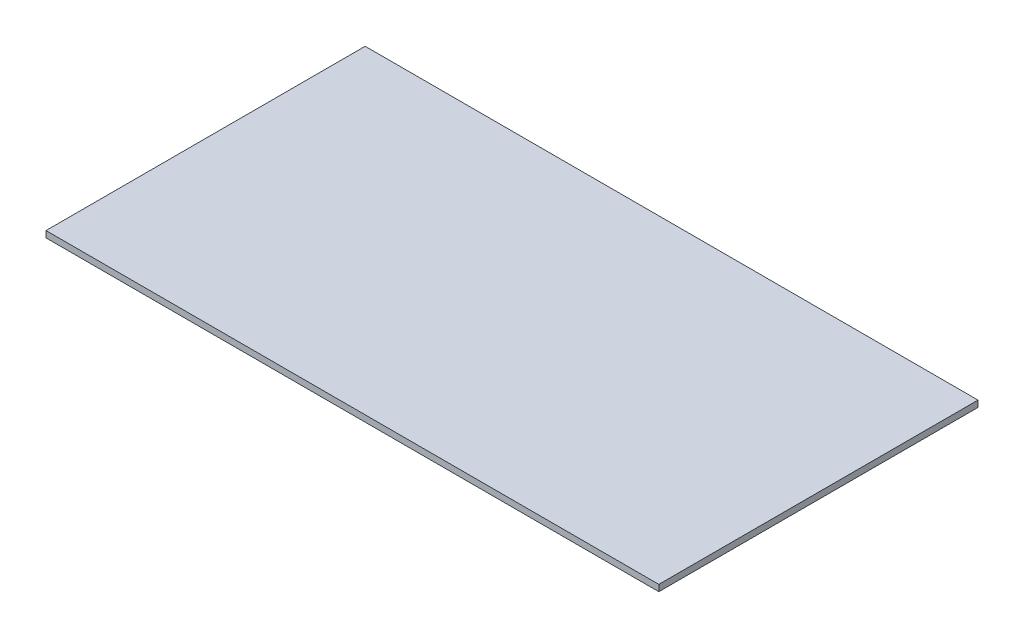
ISO-10303-21;
HEADER;
FILE_DESCRIPTION(('STEP AP214'),'2;1');
FILE_NAME('part.step','',(''),(''),'','','');
FILE_SCHEMA(('AUTOMOTIVE_DESIGN { 1 0 10303 214 1 1 1 1 }'));
ENDSEC;
DATA;
#1=APPLICATION_CONTEXT('core data for automotive mechanical design processes');
#2=APPLICATION_PROTOCOL_DEFINITION('international standard','automotive_design',2000,#1);
#3=PRODUCT_CONTEXT('',#1,'mechanical');
#4=PRODUCT('Part','Part','',(#3));
#5=PRODUCT_RELATED_PRODUCT_CATEGORY('part','',(#4));
#6=PRODUCT_DEFINITION_FORMATION('','',#4);
#7=PRODUCT_DEFINITION_CONTEXT('part definition',#1,'design');
#8=PRODUCT_DEFINITION('design','',#6,#7);
#9=PRODUCT_DEFINITION_SHAPE('','',#8);
#10=(LENGTH_UNIT() NAMED_UNIT(*) SI_UNIT(.MILLI.,.METRE.));
#11=(NAMED_UNIT(*) PLANE_ANGLE_UNIT() SI_UNIT($,.RADIAN.));
#12=(NAMED_UNIT(*) SI_UNIT($,.STERADIAN.) SOLID_ANGLE_UNIT());
#13=UNCERTAINTY_MEASURE_WITH_UNIT(LENGTH_MEASURE(1.E-05),#10,'distance_accuracy_value','');
#14=(GEOMETRIC_REPRESENTATION_CONTEXT(3) GLOBAL_UNCERTAINTY_ASSIGNED_CONTEXT((#13)) GLOBAL_UNIT_ASSIGNED_CONTEXT((#10,
#11,#12)) REPRESENTATION_CONTEXT('',''));
#15=CARTESIAN_POINT('',(0.,0.,0.));
#16=DIRECTION('',(0.,0.,1.));
#17=DIRECTION('',(1.,0.,0.));
#18=AXIS2_PLACEMENT_3D('',#15,#16,#17);
#19=CARTESIAN_POINT('',(0.,6.35,0.));
#20=DIRECTION('',(0.,1.,0.));
#21=DIRECTION('',(0.,0.,1.));
#22=AXIS2_PLACEMENT_3D('',#19,#20,#21);
#23=PLANE('',#22);
#24=DIRECTION('',(0.,0.,-1.));
#25=VECTOR('',#24,1.);
#26=CARTESIAN_POINT('',(304.8,6.35,158.75));
#27=LINE('',#26,#25);
#28=CARTESIAN_POINT('',(304.8,6.35,-158.75));
#29=VERTEX_POINT('',#28);
#30=CARTESIAN_POINT('',(304.8,6.35,158.75));
#31=VERTEX_POINT('',#30);
#32=EDGE_CURVE('E74',#29,#31,#27,.F.);
#33=ORIENTED_EDGE('',*,*,#32,.F.);
#34=DIRECTION('',(-1.,0.,0.));
#35=VECTOR('',#34,1.);
#36=CARTESIAN_POINT('',(304.8,6.35,-158.75));
#37=LINE('',#36,#35);
#38=CARTESIAN_POINT('',(-304.8,6.35,-158.75));
#39=VERTEX_POINT('',#38);
#40=EDGE_CURVE('E69',#39,#29,#37,.F.);
#41=ORIENTED_EDGE('',*,*,#40,.F.);
#42=DIRECTION('',(0.,0.,1.));
#43=VECTOR('',#42,1.);
#44=CARTESIAN_POINT('',(-304.8,6.35,-158.75));
#45=LINE('',#44,#43);
#46=CARTESIAN_POINT('',(-304.8,6.35,158.75));
#47=VERTEX_POINT('',#46);
#48=EDGE_CURVE('E84',#47,#39,#45,.F.);
#49=ORIENTED_EDGE('',*,*,#48,.F.);
#50=DIRECTION('',(1.,0.,0.));
#51=VECTOR('',#50,1.);
#52=CARTESIAN_POINT('',(-304.8,6.35,158.75));
#53=LINE('',#52,#51);
#54=EDGE_CURVE('E36',#31,#47,#53,.F.);
#55=ORIENTED_EDGE('',*,*,#54,.F.);
#56=EDGE_LOOP('',(#33,#41,#49,#55));
#57=FACE_BOUND('',#56,.T.);
#58=ADVANCED_FACE('F33',(#57),#23,.T.);
#59=CARTESIAN_POINT('',(-304.8,0.,158.75));
#60=DIRECTION('',(0.,0.,1.));
#61=DIRECTION('',(1.,0.,0.));
#62=AXIS2_PLACEMENT_3D('',#59,#60,#61);
#63=PLANE('',#62);
#64=ORIENTED_EDGE('',*,*,#54,.T.);
#65=DIRECTION('',(0.,1.,0.));
#66=VECTOR('',#65,1.);
#67=CARTESIAN_POINT('',(-304.8,0.,158.75));
#68=LINE('',#67,#66);
#69=CARTESIAN_POINT('',(-304.8,0.,158.75));
#70=VERTEX_POINT('',#69);
#71=EDGE_CURVE('E95',#70,#47,#68,.T.);
#72=ORIENTED_EDGE('',*,*,#71,.F.);
#73=DIRECTION('',(1.,0.,0.));
#74=VECTOR('',#73,1.);
#75=CARTESIAN_POINT('',(0.,0.,158.75));
#76=LINE('',#75,#74);
#77=CARTESIAN_POINT('',(304.8,0.,158.75));
#78=VERTEX_POINT('',#77);
#79=EDGE_CURVE('E90',#70,#78,#76,.T.);
#80=ORIENTED_EDGE('',*,*,#79,.T.);
#81=DIRECTION('',(0.,1.,0.));
#82=VECTOR('',#81,1.);
#83=CARTESIAN_POINT('',(304.8,0.,158.75));
#84=LINE('',#83,#82);
#85=EDGE_CURVE('E79',#31,#78,#84,.F.);
#86=ORIENTED_EDGE('',*,*,#85,.F.);
#87=EDGE_LOOP('',(#64,#72,#80,#86));
#88=FACE_BOUND('',#87,.T.);
#89=ADVANCED_FACE('F89',(#88),#63,.T.);
#90=CARTESIAN_POINT('',(304.8,0.,158.75));
#91=DIRECTION('',(1.,0.,0.));
#92=DIRECTION('',(0.,0.,-1.));
#93=AXIS2_PLACEMENT_3D('',#90,#91,#92);
#94=PLANE('',#93);
#95=ORIENTED_EDGE('',*,*,#32,.T.);
#96=ORIENTED_EDGE('',*,*,#85,.T.);
#97=DIRECTION('',(0.,0.,1.));
#98=VECTOR('',#97,1.);
#99=CARTESIAN_POINT('',(304.8,0.,0.));
#100=LINE('',#99,#98);
#101=CARTESIAN_POINT('',(304.8,0.,-158.75));
#102=VERTEX_POINT('',#101);
#103=EDGE_CURVE('E100',#78,#102,#100,.F.);
#104=ORIENTED_EDGE('',*,*,#103,.T.);
#105=DIRECTION('',(0.,1.,0.));
#106=VECTOR('',#105,1.);
#107=CARTESIAN_POINT('',(304.8,0.,-158.75));
#108=LINE('',#107,#106);
#109=EDGE_CURVE('E81',#29,#102,#108,.F.);
#110=ORIENTED_EDGE('',*,*,#109,.F.);
#111=EDGE_LOOP('',(#95,#96,#104,#110));
#112=FACE_BOUND('',#111,.T.);
#113=ADVANCED_FACE('F76',(#112),#94,.T.);
#114=CARTESIAN_POINT('',(304.8,0.,-158.75));
#115=DIRECTION('',(0.,0.,-1.));
#116=DIRECTION('',(-1.,0.,0.));
#117=AXIS2_PLACEMENT_3D('',#114,#115,#116);
#118=PLANE('',#117);
#119=ORIENTED_EDGE('',*,*,#40,.T.);
#120=ORIENTED_EDGE('',*,*,#109,.T.);
#121=DIRECTION('',(1.,0.,0.));
#122=VECTOR('',#121,1.);
#123=CARTESIAN_POINT('',(0.,0.,-158.75));
#124=LINE('',#123,#122);
#125=CARTESIAN_POINT('',(-304.8,0.,-158.75));
#126=VERTEX_POINT('',#125);
#127=EDGE_CURVE('E42',#102,#126,#124,.F.);
#128=ORIENTED_EDGE('',*,*,#127,.T.);
#129=DIRECTION('',(0.,1.,0.));
#130=VECTOR('',#129,1.);
#131=CARTESIAN_POINT('',(-304.8,0.,-158.75));
#132=LINE('',#131,#130);
#133=EDGE_CURVE('E50',#39,#126,#132,.F.);
#134=ORIENTED_EDGE('',*,*,#133,.F.);
#135=EDGE_LOOP('',(#119,#120,#128,#134));
#136=FACE_BOUND('',#135,.T.);
#137=ADVANCED_FACE('F104',(#136),#118,.T.);
#138=CARTESIAN_POINT('',(-304.8,0.,-158.75));
#139=DIRECTION('',(-1.,0.,0.));
#140=DIRECTION('',(0.,0.,1.));
#141=AXIS2_PLACEMENT_3D('',#138,#139,#140);
#142=PLANE('',#141);
#143=ORIENTED_EDGE('',*,*,#48,.T.);
#144=ORIENTED_EDGE('',*,*,#133,.T.);
#145=DIRECTION('',(0.,0.,1.));
#146=VECTOR('',#145,1.);
#147=CARTESIAN_POINT('',(-304.8,0.,0.));
#148=LINE('',#147,#146);
#149=EDGE_CURVE('E11',#126,#70,#148,.T.);
#150=ORIENTED_EDGE('',*,*,#149,.T.);
#151=ORIENTED_EDGE('',*,*,#71,.T.);
#152=EDGE_LOOP('',(#143,#144,#150,#151));
#153=FACE_BOUND('',#152,.T.);
#154=ADVANCED_FACE('F107',(#153),#142,.T.);
#155=CARTESIAN_POINT('',(0.,0.,0.));
#156=DIRECTION('',(0.,1.,0.));
#157=DIRECTION('',(0.,0.,1.));
#158=AXIS2_PLACEMENT_3D('',#155,#156,#157);
#159=PLANE('',#158);
#160=ORIENTED_EDGE('',*,*,#127,.F.);
#161=ORIENTED_EDGE('',*,*,#103,.F.);
#162=ORIENTED_EDGE('',*,*,#79,.F.);
#163=ORIENTED_EDGE('',*,*,#149,.F.);
#164=EDGE_LOOP('',(#160,#161,#162,#163));
#165=FACE_BOUND('',#164,.T.);
#166=ADVANCED_FACE('F106',(#165),#159,.F.);
#167=CLOSED_SHELL('',(#58,#89,#113,#137,#154,#166));
#168=MANIFOLD_SOLID_BREP('B2',#167);
#169=ADVANCED_BREP_SHAPE_REPRESENTATION('',(#18,#168),#14);
#170=SHAPE_DEFINITION_REPRESENTATION(#9,#169);
ENDSEC;
END-ISO-10303-21;
